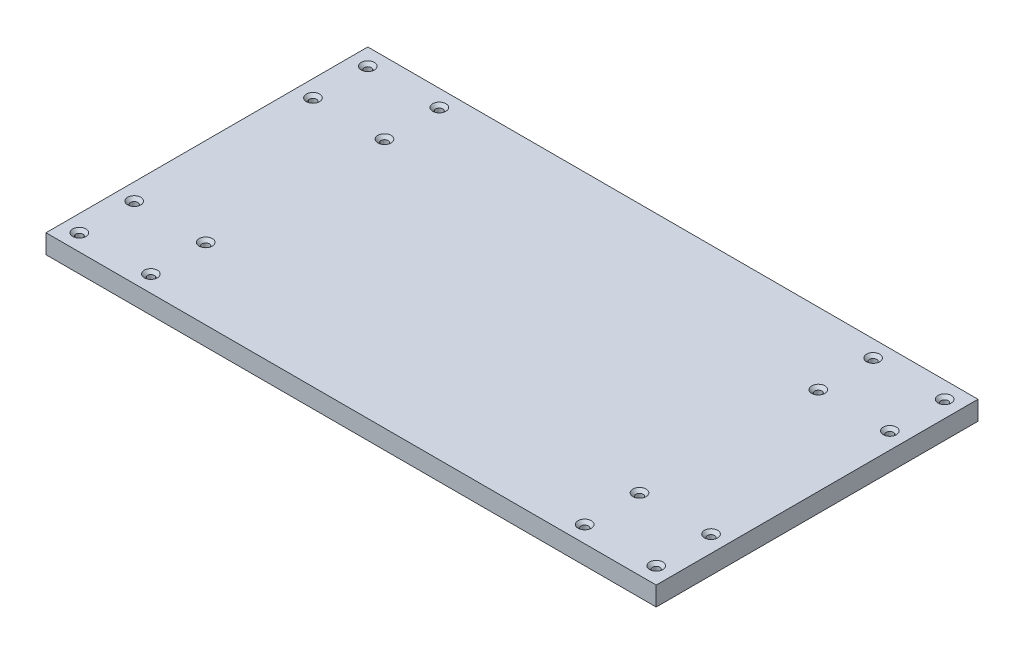
ISO-10303-21;
HEADER;
FILE_DESCRIPTION(('STEP AP214'),'2;1');
FILE_NAME('part.step','',(''),(''),'','','');
FILE_SCHEMA(('AUTOMOTIVE_DESIGN { 1 0 10303 214 1 1 1 1 }'));
ENDSEC;
DATA;
#1=APPLICATION_CONTEXT('core data for automotive mechanical design processes');
#2=APPLICATION_PROTOCOL_DEFINITION('international standard','automotive_design',2000,#1);
#3=PRODUCT_CONTEXT('',#1,'mechanical');
#4=PRODUCT('Part','Part','',(#3));
#5=PRODUCT_RELATED_PRODUCT_CATEGORY('part','',(#4));
#6=PRODUCT_DEFINITION_FORMATION('','',#4);
#7=PRODUCT_DEFINITION_CONTEXT('part definition',#1,'design');
#8=PRODUCT_DEFINITION('design','',#6,#7);
#9=PRODUCT_DEFINITION_SHAPE('','',#8);
#10=(LENGTH_UNIT() NAMED_UNIT(*) SI_UNIT(.MILLI.,.METRE.));
#11=(NAMED_UNIT(*) PLANE_ANGLE_UNIT() SI_UNIT($,.RADIAN.));
#12=(NAMED_UNIT(*) SI_UNIT($,.STERADIAN.) SOLID_ANGLE_UNIT());
#13=UNCERTAINTY_MEASURE_WITH_UNIT(LENGTH_MEASURE(1.E-05),#10,'distance_accuracy_value','');
#14=(GEOMETRIC_REPRESENTATION_CONTEXT(3) GLOBAL_UNCERTAINTY_ASSIGNED_CONTEXT((#13)) GLOBAL_UNIT_ASSIGNED_CONTEXT((#10,
#11,#12)) REPRESENTATION_CONTEXT('',''));
#15=CARTESIAN_POINT('',(0.,0.,0.));
#16=DIRECTION('',(0.,0.,1.));
#17=DIRECTION('',(1.,0.,0.));
#18=AXIS2_PLACEMENT_3D('',#15,#16,#17);
#19=CARTESIAN_POINT('',(0.,0.,0.));
#20=DIRECTION('',(0.,-1.,0.));
#21=DIRECTION('',(0.,0.,-1.));
#22=AXIS2_PLACEMENT_3D('',#19,#20,#21);
#23=PLANE('',#22);
#24=CARTESIAN_POINT('',(5.55625,0.,-101.6));
#25=DIRECTION('',(0.,1.,0.));
#26=DIRECTION('',(0.,0.,1.));
#27=AXIS2_PLACEMENT_3D('',#24,#25,#26);
#28=CIRCLE('',#27,1.2);
#29=CARTESIAN_POINT('',(5.55625,0.,-100.4));
#30=VERTEX_POINT('',#29);
#31=EDGE_CURVE('E314',#30,#30,#28,.T.);
#32=ORIENTED_EDGE('',*,*,#31,.T.);
#33=EDGE_LOOP('',(#32));
#34=FACE_BOUND('',#33,.T.);
#35=DIRECTION('',(0.,0.,1.));
#36=VECTOR('',#35,1.);
#37=CARTESIAN_POINT('',(0.,0.,0.));
#38=LINE('',#37,#36);
#39=CARTESIAN_POINT('',(0.,0.,-107.15625));
#40=VERTEX_POINT('',#39);
#41=CARTESIAN_POINT('',(0.,0.,0.));
#42=VERTEX_POINT('',#41);
#43=EDGE_CURVE('E114',#40,#42,#38,.T.);
#44=ORIENTED_EDGE('',*,*,#43,.F.);
#45=DIRECTION('',(-1.,0.,0.));
#46=VECTOR('',#45,1.);
#47=CARTESIAN_POINT('',(0.,0.,-107.15625));
#48=LINE('',#47,#46);
#49=CARTESIAN_POINT('',(203.2,0.,-107.15625));
#50=VERTEX_POINT('',#49);
#51=EDGE_CURVE('E86',#50,#40,#48,.T.);
#52=ORIENTED_EDGE('',*,*,#51,.F.);
#53=DIRECTION('',(0.,0.,-1.));
#54=VECTOR('',#53,1.);
#55=CARTESIAN_POINT('',(203.2,0.,0.));
#56=LINE('',#55,#54);
#57=CARTESIAN_POINT('',(203.2,0.,0.));
#58=VERTEX_POINT('',#57);
#59=EDGE_CURVE('E80',#58,#50,#56,.T.);
#60=ORIENTED_EDGE('',*,*,#59,.F.);
#61=DIRECTION('',(1.,0.,0.));
#62=VECTOR('',#61,1.);
#63=CARTESIAN_POINT('',(0.,0.,0.));
#64=LINE('',#63,#62);
#65=EDGE_CURVE('E103',#42,#58,#64,.T.);
#66=ORIENTED_EDGE('',*,*,#65,.F.);
#67=EDGE_LOOP('',(#44,#52,#60,#66));
#68=FACE_BOUND('',#67,.T.);
#69=CARTESIAN_POINT('',(29.36875,0.,-23.8125));
#70=DIRECTION('',(0.,1.,0.));
#71=DIRECTION('',(0.,0.,1.));
#72=AXIS2_PLACEMENT_3D('',#69,#70,#71);
#73=CIRCLE('',#72,1.2);
#74=CARTESIAN_POINT('',(29.36875,0.,-22.6125));
#75=VERTEX_POINT('',#74);
#76=EDGE_CURVE('E118',#75,#75,#73,.T.);
#77=ORIENTED_EDGE('',*,*,#76,.T.);
#78=EDGE_LOOP('',(#77));
#79=FACE_BOUND('',#78,.T.);
#80=CARTESIAN_POINT('',(197.64375,0.,-23.8125));
#81=DIRECTION('',(0.,1.,0.));
#82=DIRECTION('',(0.,0.,1.));
#83=AXIS2_PLACEMENT_3D('',#80,#81,#82);
#84=CIRCLE('',#83,1.20000000000001);
#85=CARTESIAN_POINT('',(197.64375,0.,-22.6125));
#86=VERTEX_POINT('',#85);
#87=EDGE_CURVE('E146',#86,#86,#84,.T.);
#88=ORIENTED_EDGE('',*,*,#87,.T.);
#89=EDGE_LOOP('',(#88));
#90=FACE_BOUND('',#89,.T.);
#91=CARTESIAN_POINT('',(173.83125,0.,-23.8125));
#92=DIRECTION('',(0.,1.,0.));
#93=DIRECTION('',(0.,0.,1.));
#94=AXIS2_PLACEMENT_3D('',#91,#92,#93);
#95=CIRCLE('',#94,1.20000000000001);
#96=CARTESIAN_POINT('',(173.83125,0.,-22.6125));
#97=VERTEX_POINT('',#96);
#98=EDGE_CURVE('E158',#97,#97,#95,.T.);
#99=ORIENTED_EDGE('',*,*,#98,.T.);
#100=EDGE_LOOP('',(#99));
#101=FACE_BOUND('',#100,.T.);
#102=CARTESIAN_POINT('',(197.64375,0.,-83.34375));
#103=DIRECTION('',(0.,1.,0.));
#104=DIRECTION('',(0.,0.,1.));
#105=AXIS2_PLACEMENT_3D('',#102,#103,#104);
#106=CIRCLE('',#105,1.20000000000001);
#107=CARTESIAN_POINT('',(197.64375,0.,-82.14375));
#108=VERTEX_POINT('',#107);
#109=EDGE_CURVE('E170',#108,#108,#106,.T.);
#110=ORIENTED_EDGE('',*,*,#109,.T.);
#111=EDGE_LOOP('',(#110));
#112=FACE_BOUND('',#111,.T.);
#113=CARTESIAN_POINT('',(173.83125,0.,-83.34375));
#114=DIRECTION('',(0.,1.,0.));
#115=DIRECTION('',(0.,0.,1.));
#116=AXIS2_PLACEMENT_3D('',#113,#114,#115);
#117=CIRCLE('',#116,1.20000000000001);
#118=CARTESIAN_POINT('',(173.83125,0.,-82.14375));
#119=VERTEX_POINT('',#118);
#120=EDGE_CURVE('E182',#119,#119,#117,.T.);
#121=ORIENTED_EDGE('',*,*,#120,.T.);
#122=EDGE_LOOP('',(#121));
#123=FACE_BOUND('',#122,.T.);
#124=CARTESIAN_POINT('',(5.55625,0.,-23.8125));
#125=DIRECTION('',(0.,1.,0.));
#126=DIRECTION('',(0.,0.,1.));
#127=AXIS2_PLACEMENT_3D('',#124,#125,#126);
#128=CIRCLE('',#127,1.2);
#129=CARTESIAN_POINT('',(5.55625,0.,-22.6125));
#130=VERTEX_POINT('',#129);
#131=EDGE_CURVE('E194',#130,#130,#128,.T.);
#132=ORIENTED_EDGE('',*,*,#131,.T.);
#133=EDGE_LOOP('',(#132));
#134=FACE_BOUND('',#133,.T.);
#135=CARTESIAN_POINT('',(29.36875,0.,-83.34375));
#136=DIRECTION('',(0.,1.,0.));
#137=DIRECTION('',(0.,0.,1.));
#138=AXIS2_PLACEMENT_3D('',#135,#136,#137);
#139=CIRCLE('',#138,1.2);
#140=CARTESIAN_POINT('',(29.36875,0.,-82.14375));
#141=VERTEX_POINT('',#140);
#142=EDGE_CURVE('E206',#141,#141,#139,.T.);
#143=ORIENTED_EDGE('',*,*,#142,.T.);
#144=EDGE_LOOP('',(#143));
#145=FACE_BOUND('',#144,.T.);
#146=CARTESIAN_POINT('',(5.55625000000001,0.,-83.34375));
#147=DIRECTION('',(0.,1.,0.));
#148=DIRECTION('',(0.,0.,1.));
#149=AXIS2_PLACEMENT_3D('',#146,#147,#148);
#150=CIRCLE('',#149,1.2);
#151=CARTESIAN_POINT('',(5.55625000000001,0.,-82.14375));
#152=VERTEX_POINT('',#151);
#153=EDGE_CURVE('E218',#152,#152,#150,.T.);
#154=ORIENTED_EDGE('',*,*,#153,.T.);
#155=EDGE_LOOP('',(#154));
#156=FACE_BOUND('',#155,.T.);
#157=CARTESIAN_POINT('',(197.64375,0.,-5.55625));
#158=DIRECTION('',(0.,1.,0.));
#159=DIRECTION('',(0.,0.,1.));
#160=AXIS2_PLACEMENT_3D('',#157,#158,#159);
#161=CIRCLE('',#160,1.20000000000001);
#162=CARTESIAN_POINT('',(197.64375,0.,-4.35624999999999));
#163=VERTEX_POINT('',#162);
#164=EDGE_CURVE('E230',#163,#163,#161,.T.);
#165=ORIENTED_EDGE('',*,*,#164,.T.);
#166=EDGE_LOOP('',(#165));
#167=FACE_BOUND('',#166,.T.);
#168=CARTESIAN_POINT('',(197.64375,0.,-101.6));
#169=DIRECTION('',(0.,1.,0.));
#170=DIRECTION('',(0.,0.,1.));
#171=AXIS2_PLACEMENT_3D('',#168,#169,#170);
#172=CIRCLE('',#171,1.20000000000001);
#173=CARTESIAN_POINT('',(197.64375,0.,-100.4));
#174=VERTEX_POINT('',#173);
#175=EDGE_CURVE('E242',#174,#174,#172,.T.);
#176=ORIENTED_EDGE('',*,*,#175,.T.);
#177=EDGE_LOOP('',(#176));
#178=FACE_BOUND('',#177,.T.);
#179=CARTESIAN_POINT('',(173.83125,0.,-101.6));
#180=DIRECTION('',(0.,1.,0.));
#181=DIRECTION('',(0.,0.,1.));
#182=AXIS2_PLACEMENT_3D('',#179,#180,#181);
#183=CIRCLE('',#182,1.20000000000001);
#184=CARTESIAN_POINT('',(173.83125,0.,-100.4));
#185=VERTEX_POINT('',#184);
#186=EDGE_CURVE('E254',#185,#185,#183,.T.);
#187=ORIENTED_EDGE('',*,*,#186,.T.);
#188=EDGE_LOOP('',(#187));
#189=FACE_BOUND('',#188,.T.);
#190=CARTESIAN_POINT('',(173.83125,0.,-5.55625));
#191=DIRECTION('',(0.,1.,0.));
#192=DIRECTION('',(0.,0.,1.));
#193=AXIS2_PLACEMENT_3D('',#190,#191,#192);
#194=CIRCLE('',#193,1.20000000000001);
#195=CARTESIAN_POINT('',(173.83125,0.,-4.35624999999999));
#196=VERTEX_POINT('',#195);
#197=EDGE_CURVE('E266',#196,#196,#194,.T.);
#198=ORIENTED_EDGE('',*,*,#197,.T.);
#199=EDGE_LOOP('',(#198));
#200=FACE_BOUND('',#199,.T.);
#201=CARTESIAN_POINT('',(29.36875,0.,-5.55625));
#202=DIRECTION('',(0.,1.,0.));
#203=DIRECTION('',(0.,0.,1.));
#204=AXIS2_PLACEMENT_3D('',#201,#202,#203);
#205=CIRCLE('',#204,1.2);
#206=CARTESIAN_POINT('',(29.36875,0.,-4.35625));
#207=VERTEX_POINT('',#206);
#208=EDGE_CURVE('E278',#207,#207,#205,.T.);
#209=ORIENTED_EDGE('',*,*,#208,.T.);
#210=EDGE_LOOP('',(#209));
#211=FACE_BOUND('',#210,.T.);
#212=CARTESIAN_POINT('',(5.55625,0.,-5.55625));
#213=DIRECTION('',(0.,1.,0.));
#214=DIRECTION('',(0.,0.,1.));
#215=AXIS2_PLACEMENT_3D('',#212,#213,#214);
#216=CIRCLE('',#215,1.2);
#217=CARTESIAN_POINT('',(5.55625,0.,-4.35625));
#218=VERTEX_POINT('',#217);
#219=EDGE_CURVE('E290',#218,#218,#216,.T.);
#220=ORIENTED_EDGE('',*,*,#219,.T.);
#221=EDGE_LOOP('',(#220));
#222=FACE_BOUND('',#221,.T.);
#223=CARTESIAN_POINT('',(29.36875,0.,-101.6));
#224=DIRECTION('',(0.,1.,0.));
#225=DIRECTION('',(0.,0.,1.));
#226=AXIS2_PLACEMENT_3D('',#223,#224,#225);
#227=CIRCLE('',#226,1.2);
#228=CARTESIAN_POINT('',(29.36875,0.,-100.4));
#229=VERTEX_POINT('',#228);
#230=EDGE_CURVE('E302',#229,#229,#227,.T.);
#231=ORIENTED_EDGE('',*,*,#230,.T.);
#232=EDGE_LOOP('',(#231));
#233=FACE_BOUND('',#232,.T.);
#234=ADVANCED_FACE('F45',(#34,#68,#79,#90,#101,#112,#123,#134,#145,#156,#167,#178,#189,#200,
#211,#222,#233),#23,.T.);
#235=CARTESIAN_POINT('',(0.,6.35,0.));
#236=DIRECTION('',(1.,0.,0.));
#237=DIRECTION('',(0.,0.,-1.));
#238=AXIS2_PLACEMENT_3D('',#235,#236,#237);
#239=PLANE('',#238);
#240=ORIENTED_EDGE('',*,*,#43,.T.);
#241=DIRECTION('',(0.,-1.,0.));
#242=VECTOR('',#241,1.);
#243=CARTESIAN_POINT('',(0.,6.35,0.));
#244=LINE('',#243,#242);
#245=CARTESIAN_POINT('',(0.,6.35,0.));
#246=VERTEX_POINT('',#245);
#247=EDGE_CURVE('E11',#246,#42,#244,.T.);
#248=ORIENTED_EDGE('',*,*,#247,.F.);
#249=DIRECTION('',(0.,0.,1.));
#250=VECTOR('',#249,1.);
#251=CARTESIAN_POINT('',(0.,6.35,0.));
#252=LINE('',#251,#250);
#253=CARTESIAN_POINT('',(0.,6.35,-107.15625));
#254=VERTEX_POINT('',#253);
#255=EDGE_CURVE('E98',#254,#246,#252,.T.);
#256=ORIENTED_EDGE('',*,*,#255,.F.);
#257=DIRECTION('',(0.,-1.,0.));
#258=VECTOR('',#257,1.);
#259=CARTESIAN_POINT('',(0.,6.35,-107.15625));
#260=LINE('',#259,#258);
#261=EDGE_CURVE('E110',#254,#40,#260,.T.);
#262=ORIENTED_EDGE('',*,*,#261,.T.);
#263=EDGE_LOOP('',(#240,#248,#256,#262));
#264=FACE_BOUND('',#263,.T.);
#265=ADVANCED_FACE('F47',(#264),#239,.F.);
#266=CARTESIAN_POINT('',(0.,6.35,0.));
#267=DIRECTION('',(0.,0.,-1.));
#268=DIRECTION('',(-1.,0.,0.));
#269=AXIS2_PLACEMENT_3D('',#266,#267,#268);
#270=PLANE('',#269);
#271=ORIENTED_EDGE('',*,*,#65,.T.);
#272=DIRECTION('',(0.,-1.,0.));
#273=VECTOR('',#272,1.);
#274=CARTESIAN_POINT('',(203.2,6.35,0.));
#275=LINE('',#274,#273);
#276=CARTESIAN_POINT('',(203.2,6.35,0.));
#277=VERTEX_POINT('',#276);
#278=EDGE_CURVE('E55',#277,#58,#275,.T.);
#279=ORIENTED_EDGE('',*,*,#278,.F.);
#280=DIRECTION('',(1.,0.,0.));
#281=VECTOR('',#280,1.);
#282=CARTESIAN_POINT('',(0.,6.35,0.));
#283=LINE('',#282,#281);
#284=EDGE_CURVE('E93',#246,#277,#283,.T.);
#285=ORIENTED_EDGE('',*,*,#284,.F.);
#286=ORIENTED_EDGE('',*,*,#247,.T.);
#287=EDGE_LOOP('',(#271,#279,#285,#286));
#288=FACE_BOUND('',#287,.T.);
#289=ADVANCED_FACE('F102',(#288),#270,.F.);
#290=CARTESIAN_POINT('',(203.2,6.35,0.));
#291=DIRECTION('',(-1.,0.,0.));
#292=DIRECTION('',(0.,0.,1.));
#293=AXIS2_PLACEMENT_3D('',#290,#291,#292);
#294=PLANE('',#293);
#295=ORIENTED_EDGE('',*,*,#59,.T.);
#296=DIRECTION('',(0.,-1.,0.));
#297=VECTOR('',#296,1.);
#298=CARTESIAN_POINT('',(203.2,6.35,-107.15625));
#299=LINE('',#298,#297);
#300=CARTESIAN_POINT('',(203.2,6.35,-107.15625));
#301=VERTEX_POINT('',#300);
#302=EDGE_CURVE('E105',#301,#50,#299,.T.);
#303=ORIENTED_EDGE('',*,*,#302,.F.);
#304=DIRECTION('',(0.,0.,-1.));
#305=VECTOR('',#304,1.);
#306=CARTESIAN_POINT('',(203.2,6.35,0.));
#307=LINE('',#306,#305);
#308=EDGE_CURVE('E96',#277,#301,#307,.T.);
#309=ORIENTED_EDGE('',*,*,#308,.F.);
#310=ORIENTED_EDGE('',*,*,#278,.T.);
#311=EDGE_LOOP('',(#295,#303,#309,#310));
#312=FACE_BOUND('',#311,.T.);
#313=ADVANCED_FACE('F106',(#312),#294,.F.);
#314=CARTESIAN_POINT('',(0.,6.35,-107.15625));
#315=DIRECTION('',(0.,0.,1.));
#316=DIRECTION('',(1.,0.,0.));
#317=AXIS2_PLACEMENT_3D('',#314,#315,#316);
#318=PLANE('',#317);
#319=ORIENTED_EDGE('',*,*,#51,.T.);
#320=ORIENTED_EDGE('',*,*,#261,.F.);
#321=DIRECTION('',(-1.,0.,0.));
#322=VECTOR('',#321,1.);
#323=CARTESIAN_POINT('',(0.,6.35,-107.15625));
#324=LINE('',#323,#322);
#325=EDGE_CURVE('E63',#301,#254,#324,.T.);
#326=ORIENTED_EDGE('',*,*,#325,.F.);
#327=ORIENTED_EDGE('',*,*,#302,.T.);
#328=EDGE_LOOP('',(#319,#320,#326,#327));
#329=FACE_BOUND('',#328,.T.);
#330=ADVANCED_FACE('F128',(#329),#318,.F.);
#331=CARTESIAN_POINT('',(0.,6.35,0.));
#332=DIRECTION('',(0.,-1.,0.));
#333=DIRECTION('',(0.,0.,-1.));
#334=AXIS2_PLACEMENT_3D('',#331,#332,#333);
#335=PLANE('',#334);
#336=CARTESIAN_POINT('',(5.55625,6.35,-101.6));
#337=DIRECTION('',(0.,1.,0.));
#338=DIRECTION('',(0.,0.,1.));
#339=AXIS2_PLACEMENT_3D('',#336,#337,#338);
#340=CIRCLE('',#339,2.2);
#341=CARTESIAN_POINT('',(5.55625,6.35,-99.4));
#342=VERTEX_POINT('',#341);
#343=EDGE_CURVE('E322',#342,#342,#340,.T.);
#344=ORIENTED_EDGE('',*,*,#343,.F.);
#345=EDGE_LOOP('',(#344));
#346=FACE_BOUND('',#345,.T.);
#347=CARTESIAN_POINT('',(29.36875,6.35,-101.6));
#348=DIRECTION('',(0.,1.,0.));
#349=DIRECTION('',(0.,0.,1.));
#350=AXIS2_PLACEMENT_3D('',#347,#348,#349);
#351=CIRCLE('',#350,2.2);
#352=CARTESIAN_POINT('',(29.36875,6.35,-99.4));
#353=VERTEX_POINT('',#352);
#354=EDGE_CURVE('E310',#353,#353,#351,.T.);
#355=ORIENTED_EDGE('',*,*,#354,.F.);
#356=EDGE_LOOP('',(#355));
#357=FACE_BOUND('',#356,.T.);
#358=CARTESIAN_POINT('',(5.55625,6.35,-5.55625));
#359=DIRECTION('',(0.,1.,0.));
#360=DIRECTION('',(0.,0.,1.));
#361=AXIS2_PLACEMENT_3D('',#358,#359,#360);
#362=CIRCLE('',#361,2.2);
#363=CARTESIAN_POINT('',(5.55625,6.35,-3.35625));
#364=VERTEX_POINT('',#363);
#365=EDGE_CURVE('E298',#364,#364,#362,.T.);
#366=ORIENTED_EDGE('',*,*,#365,.F.);
#367=EDGE_LOOP('',(#366));
#368=FACE_BOUND('',#367,.T.);
#369=CARTESIAN_POINT('',(29.36875,6.35,-5.55625));
#370=DIRECTION('',(0.,1.,0.));
#371=DIRECTION('',(0.,0.,1.));
#372=AXIS2_PLACEMENT_3D('',#369,#370,#371);
#373=CIRCLE('',#372,2.2);
#374=CARTESIAN_POINT('',(29.36875,6.35,-3.35625));
#375=VERTEX_POINT('',#374);
#376=EDGE_CURVE('E286',#375,#375,#373,.T.);
#377=ORIENTED_EDGE('',*,*,#376,.F.);
#378=EDGE_LOOP('',(#377));
#379=FACE_BOUND('',#378,.T.);
#380=CARTESIAN_POINT('',(173.83125,6.35,-5.55625));
#381=DIRECTION('',(0.,1.,0.));
#382=DIRECTION('',(0.,0.,1.));
#383=AXIS2_PLACEMENT_3D('',#380,#381,#382);
#384=CIRCLE('',#383,2.20000000000001);
#385=CARTESIAN_POINT('',(173.83125,6.35,-3.35624999999999));
#386=VERTEX_POINT('',#385);
#387=EDGE_CURVE('E274',#386,#386,#384,.T.);
#388=ORIENTED_EDGE('',*,*,#387,.F.);
#389=EDGE_LOOP('',(#388));
#390=FACE_BOUND('',#389,.T.);
#391=CARTESIAN_POINT('',(173.83125,6.35,-101.6));
#392=DIRECTION('',(0.,1.,0.));
#393=DIRECTION('',(0.,0.,1.));
#394=AXIS2_PLACEMENT_3D('',#391,#392,#393);
#395=CIRCLE('',#394,2.20000000000001);
#396=CARTESIAN_POINT('',(173.83125,6.35,-99.4));
#397=VERTEX_POINT('',#396);
#398=EDGE_CURVE('E262',#397,#397,#395,.T.);
#399=ORIENTED_EDGE('',*,*,#398,.F.);
#400=EDGE_LOOP('',(#399));
#401=FACE_BOUND('',#400,.T.);
#402=CARTESIAN_POINT('',(197.64375,6.35,-101.6));
#403=DIRECTION('',(0.,1.,0.));
#404=DIRECTION('',(0.,0.,1.));
#405=AXIS2_PLACEMENT_3D('',#402,#403,#404);
#406=CIRCLE('',#405,2.20000000000001);
#407=CARTESIAN_POINT('',(197.64375,6.35,-99.4));
#408=VERTEX_POINT('',#407);
#409=EDGE_CURVE('E250',#408,#408,#406,.T.);
#410=ORIENTED_EDGE('',*,*,#409,.F.);
#411=EDGE_LOOP('',(#410));
#412=FACE_BOUND('',#411,.T.);
#413=CARTESIAN_POINT('',(197.64375,6.35,-5.55625));
#414=DIRECTION('',(0.,1.,0.));
#415=DIRECTION('',(0.,0.,1.));
#416=AXIS2_PLACEMENT_3D('',#413,#414,#415);
#417=CIRCLE('',#416,2.20000000000001);
#418=CARTESIAN_POINT('',(197.64375,6.35,-3.35624999999999));
#419=VERTEX_POINT('',#418);
#420=EDGE_CURVE('E238',#419,#419,#417,.T.);
#421=ORIENTED_EDGE('',*,*,#420,.F.);
#422=EDGE_LOOP('',(#421));
#423=FACE_BOUND('',#422,.T.);
#424=CARTESIAN_POINT('',(5.55625000000001,6.35,-83.34375));
#425=DIRECTION('',(0.,1.,0.));
#426=DIRECTION('',(0.,0.,1.));
#427=AXIS2_PLACEMENT_3D('',#424,#425,#426);
#428=CIRCLE('',#427,2.2);
#429=CARTESIAN_POINT('',(5.55625000000001,6.35,-81.14375));
#430=VERTEX_POINT('',#429);
#431=EDGE_CURVE('E226',#430,#430,#428,.T.);
#432=ORIENTED_EDGE('',*,*,#431,.F.);
#433=EDGE_LOOP('',(#432));
#434=FACE_BOUND('',#433,.T.);
#435=CARTESIAN_POINT('',(29.36875,6.35,-83.34375));
#436=DIRECTION('',(0.,1.,0.));
#437=DIRECTION('',(0.,0.,1.));
#438=AXIS2_PLACEMENT_3D('',#435,#436,#437);
#439=CIRCLE('',#438,2.2);
#440=CARTESIAN_POINT('',(29.36875,6.35,-81.14375));
#441=VERTEX_POINT('',#440);
#442=EDGE_CURVE('E214',#441,#441,#439,.T.);
#443=ORIENTED_EDGE('',*,*,#442,.F.);
#444=EDGE_LOOP('',(#443));
#445=FACE_BOUND('',#444,.T.);
#446=CARTESIAN_POINT('',(5.55625,6.35,-23.8125));
#447=DIRECTION('',(0.,1.,0.));
#448=DIRECTION('',(0.,0.,1.));
#449=AXIS2_PLACEMENT_3D('',#446,#447,#448);
#450=CIRCLE('',#449,2.2);
#451=CARTESIAN_POINT('',(5.55625,6.35,-21.6125));
#452=VERTEX_POINT('',#451);
#453=EDGE_CURVE('E202',#452,#452,#450,.T.);
#454=ORIENTED_EDGE('',*,*,#453,.F.);
#455=EDGE_LOOP('',(#454));
#456=FACE_BOUND('',#455,.T.);
#457=CARTESIAN_POINT('',(173.83125,6.35,-83.34375));
#458=DIRECTION('',(0.,1.,0.));
#459=DIRECTION('',(0.,0.,1.));
#460=AXIS2_PLACEMENT_3D('',#457,#458,#459);
#461=CIRCLE('',#460,2.20000000000001);
#462=CARTESIAN_POINT('',(173.83125,6.35,-81.14375));
#463=VERTEX_POINT('',#462);
#464=EDGE_CURVE('E190',#463,#463,#461,.T.);
#465=ORIENTED_EDGE('',*,*,#464,.F.);
#466=EDGE_LOOP('',(#465));
#467=FACE_BOUND('',#466,.T.);
#468=CARTESIAN_POINT('',(197.64375,6.35,-83.34375));
#469=DIRECTION('',(0.,1.,0.));
#470=DIRECTION('',(0.,0.,1.));
#471=AXIS2_PLACEMENT_3D('',#468,#469,#470);
#472=CIRCLE('',#471,2.20000000000001);
#473=CARTESIAN_POINT('',(197.64375,6.35,-81.14375));
#474=VERTEX_POINT('',#473);
#475=EDGE_CURVE('E178',#474,#474,#472,.T.);
#476=ORIENTED_EDGE('',*,*,#475,.F.);
#477=EDGE_LOOP('',(#476));
#478=FACE_BOUND('',#477,.T.);
#479=CARTESIAN_POINT('',(173.83125,6.35,-23.8125));
#480=DIRECTION('',(0.,1.,0.));
#481=DIRECTION('',(0.,0.,1.));
#482=AXIS2_PLACEMENT_3D('',#479,#480,#481);
#483=CIRCLE('',#482,2.20000000000001);
#484=CARTESIAN_POINT('',(173.83125,6.35,-21.6125));
#485=VERTEX_POINT('',#484);
#486=EDGE_CURVE('E166',#485,#485,#483,.T.);
#487=ORIENTED_EDGE('',*,*,#486,.F.);
#488=EDGE_LOOP('',(#487));
#489=FACE_BOUND('',#488,.T.);
#490=CARTESIAN_POINT('',(197.64375,6.35,-23.8125));
#491=DIRECTION('',(0.,1.,0.));
#492=DIRECTION('',(0.,0.,1.));
#493=AXIS2_PLACEMENT_3D('',#490,#491,#492);
#494=CIRCLE('',#493,2.20000000000001);
#495=CARTESIAN_POINT('',(197.64375,6.35,-21.6125));
#496=VERTEX_POINT('',#495);
#497=EDGE_CURVE('E154',#496,#496,#494,.T.);
#498=ORIENTED_EDGE('',*,*,#497,.F.);
#499=EDGE_LOOP('',(#498));
#500=FACE_BOUND('',#499,.T.);
#501=CARTESIAN_POINT('',(29.36875,6.35,-23.8125));
#502=DIRECTION('',(0.,1.,0.));
#503=DIRECTION('',(0.,0.,1.));
#504=AXIS2_PLACEMENT_3D('',#501,#502,#503);
#505=CIRCLE('',#504,2.2);
#506=CARTESIAN_POINT('',(29.36875,6.35,-21.6125));
#507=VERTEX_POINT('',#506);
#508=EDGE_CURVE('E142',#507,#507,#505,.T.);
#509=ORIENTED_EDGE('',*,*,#508,.F.);
#510=EDGE_LOOP('',(#509));
#511=FACE_BOUND('',#510,.T.);
#512=ORIENTED_EDGE('',*,*,#255,.T.);
#513=ORIENTED_EDGE('',*,*,#284,.T.);
#514=ORIENTED_EDGE('',*,*,#308,.T.);
#515=ORIENTED_EDGE('',*,*,#325,.T.);
#516=EDGE_LOOP('',(#512,#513,#514,#515));
#517=FACE_BOUND('',#516,.T.);
#518=ADVANCED_FACE('F94',(#346,#357,#368,#379,#390,#401,#412,#423,#434,#445,#456,#467,#478,#489,
#500,#511,#517),#335,.F.);
#519=CARTESIAN_POINT('',(29.36875,6.35,-23.8125));
#520=DIRECTION('',(0.,1.,0.));
#521=DIRECTION('',(0.,0.,1.));
#522=AXIS2_PLACEMENT_3D('',#519,#520,#521);
#523=CYLINDRICAL_SURFACE('',#522,1.2);
#524=ORIENTED_EDGE('',*,*,#76,.F.);
#525=EDGE_LOOP('',(#524));
#526=FACE_BOUND('',#525,.T.);
#527=CARTESIAN_POINT('',(29.36875,5.35,-23.8125));
#528=DIRECTION('',(0.,1.,0.));
#529=DIRECTION('',(0.,0.,1.));
#530=AXIS2_PLACEMENT_3D('',#527,#528,#529);
#531=CIRCLE('',#530,1.2);
#532=CARTESIAN_POINT('',(29.36875,5.35,-22.6125));
#533=VERTEX_POINT('',#532);
#534=EDGE_CURVE('E138',#533,#533,#531,.T.);
#535=ORIENTED_EDGE('',*,*,#534,.T.);
#536=EDGE_LOOP('',(#535));
#537=FACE_BOUND('',#536,.T.);
#538=ADVANCED_FACE('F331',(#526,#537),#523,.F.);
#539=CARTESIAN_POINT('',(29.36875,6.35,-23.8125));
#540=DIRECTION('',(0.,1.,0.));
#541=DIRECTION('',(0.,0.,1.));
#542=AXIS2_PLACEMENT_3D('',#539,#540,#541);
#543=CONICAL_SURFACE('',#542,2.2,0.785398163397448);
#544=ORIENTED_EDGE('',*,*,#534,.F.);
#545=EDGE_LOOP('',(#544));
#546=FACE_BOUND('',#545,.T.);
#547=ORIENTED_EDGE('',*,*,#508,.T.);
#548=EDGE_LOOP('',(#547));
#549=FACE_BOUND('',#548,.T.);
#550=ADVANCED_FACE('F363',(#546,#549),#543,.F.);
#551=CARTESIAN_POINT('',(197.64375,6.35,-23.8125));
#552=DIRECTION('',(0.,1.,0.));
#553=DIRECTION('',(0.,0.,1.));
#554=AXIS2_PLACEMENT_3D('',#551,#552,#553);
#555=CYLINDRICAL_SURFACE('',#554,1.20000000000001);
#556=ORIENTED_EDGE('',*,*,#87,.F.);
#557=EDGE_LOOP('',(#556));
#558=FACE_BOUND('',#557,.T.);
#559=CARTESIAN_POINT('',(197.64375,5.35,-23.8125));
#560=DIRECTION('',(0.,1.,0.));
#561=DIRECTION('',(0.,0.,1.));
#562=AXIS2_PLACEMENT_3D('',#559,#560,#561);
#563=CIRCLE('',#562,1.20000000000001);
#564=CARTESIAN_POINT('',(197.64375,5.35,-22.6125));
#565=VERTEX_POINT('',#564);
#566=EDGE_CURVE('E150',#565,#565,#563,.T.);
#567=ORIENTED_EDGE('',*,*,#566,.T.);
#568=EDGE_LOOP('',(#567));
#569=FACE_BOUND('',#568,.T.);
#570=ADVANCED_FACE('F365',(#558,#569),#555,.F.);
#571=CARTESIAN_POINT('',(197.64375,6.35,-23.8125));
#572=DIRECTION('',(0.,1.,0.));
#573=DIRECTION('',(0.,0.,1.));
#574=AXIS2_PLACEMENT_3D('',#571,#572,#573);
#575=CONICAL_SURFACE('',#574,2.20000000000001,0.785398163397448);
#576=ORIENTED_EDGE('',*,*,#566,.F.);
#577=EDGE_LOOP('',(#576));
#578=FACE_BOUND('',#577,.T.);
#579=ORIENTED_EDGE('',*,*,#497,.T.);
#580=EDGE_LOOP('',(#579));
#581=FACE_BOUND('',#580,.T.);
#582=ADVANCED_FACE('F372',(#578,#581),#575,.F.);
#583=CARTESIAN_POINT('',(173.83125,6.35,-23.8125));
#584=DIRECTION('',(0.,1.,0.));
#585=DIRECTION('',(0.,0.,1.));
#586=AXIS2_PLACEMENT_3D('',#583,#584,#585);
#587=CYLINDRICAL_SURFACE('',#586,1.20000000000001);
#588=ORIENTED_EDGE('',*,*,#98,.F.);
#589=EDGE_LOOP('',(#588));
#590=FACE_BOUND('',#589,.T.);
#591=CARTESIAN_POINT('',(173.83125,5.35,-23.8125));
#592=DIRECTION('',(0.,1.,0.));
#593=DIRECTION('',(0.,0.,1.));
#594=AXIS2_PLACEMENT_3D('',#591,#592,#593);
#595=CIRCLE('',#594,1.20000000000001);
#596=CARTESIAN_POINT('',(173.83125,5.35,-22.6125));
#597=VERTEX_POINT('',#596);
#598=EDGE_CURVE('E162',#597,#597,#595,.T.);
#599=ORIENTED_EDGE('',*,*,#598,.T.);
#600=EDGE_LOOP('',(#599));
#601=FACE_BOUND('',#600,.T.);
#602=ADVANCED_FACE('F439',(#590,#601),#587,.F.);
#603=CARTESIAN_POINT('',(173.83125,6.35,-23.8125));
#604=DIRECTION('',(0.,1.,0.));
#605=DIRECTION('',(0.,0.,1.));
#606=AXIS2_PLACEMENT_3D('',#603,#604,#605);
#607=CONICAL_SURFACE('',#606,2.20000000000001,0.785398163397448);
#608=ORIENTED_EDGE('',*,*,#598,.F.);
#609=EDGE_LOOP('',(#608));
#610=FACE_BOUND('',#609,.T.);
#611=ORIENTED_EDGE('',*,*,#486,.T.);
#612=EDGE_LOOP('',(#611));
#613=FACE_BOUND('',#612,.T.);
#614=ADVANCED_FACE('F449',(#610,#613),#607,.F.);
#615=CARTESIAN_POINT('',(197.64375,6.35,-83.34375));
#616=DIRECTION('',(0.,1.,0.));
#617=DIRECTION('',(0.,0.,1.));
#618=AXIS2_PLACEMENT_3D('',#615,#616,#617);
#619=CYLINDRICAL_SURFACE('',#618,1.20000000000001);
#620=ORIENTED_EDGE('',*,*,#109,.F.);
#621=EDGE_LOOP('',(#620));
#622=FACE_BOUND('',#621,.T.);
#623=CARTESIAN_POINT('',(197.64375,5.35,-83.34375));
#624=DIRECTION('',(0.,1.,0.));
#625=DIRECTION('',(0.,0.,1.));
#626=AXIS2_PLACEMENT_3D('',#623,#624,#625);
#627=CIRCLE('',#626,1.20000000000001);
#628=CARTESIAN_POINT('',(197.64375,5.35,-82.14375));
#629=VERTEX_POINT('',#628);
#630=EDGE_CURVE('E174',#629,#629,#627,.T.);
#631=ORIENTED_EDGE('',*,*,#630,.T.);
#632=EDGE_LOOP('',(#631));
#633=FACE_BOUND('',#632,.T.);
#634=ADVANCED_FACE('F459',(#622,#633),#619,.F.);
#635=CARTESIAN_POINT('',(197.64375,6.35,-83.34375));
#636=DIRECTION('',(0.,1.,0.));
#637=DIRECTION('',(0.,0.,1.));
#638=AXIS2_PLACEMENT_3D('',#635,#636,#637);
#639=CONICAL_SURFACE('',#638,2.20000000000001,0.785398163397448);
#640=ORIENTED_EDGE('',*,*,#630,.F.);
#641=EDGE_LOOP('',(#640));
#642=FACE_BOUND('',#641,.T.);
#643=ORIENTED_EDGE('',*,*,#475,.T.);
#644=EDGE_LOOP('',(#643));
#645=FACE_BOUND('',#644,.T.);
#646=ADVANCED_FACE('F469',(#642,#645),#639,.F.);
#647=CARTESIAN_POINT('',(173.83125,6.35,-83.34375));
#648=DIRECTION('',(0.,1.,0.));
#649=DIRECTION('',(0.,0.,1.));
#650=AXIS2_PLACEMENT_3D('',#647,#648,#649);
#651=CYLINDRICAL_SURFACE('',#650,1.20000000000001);
#652=ORIENTED_EDGE('',*,*,#120,.F.);
#653=EDGE_LOOP('',(#652));
#654=FACE_BOUND('',#653,.T.);
#655=CARTESIAN_POINT('',(173.83125,5.35,-83.34375));
#656=DIRECTION('',(0.,1.,0.));
#657=DIRECTION('',(0.,0.,1.));
#658=AXIS2_PLACEMENT_3D('',#655,#656,#657);
#659=CIRCLE('',#658,1.20000000000001);
#660=CARTESIAN_POINT('',(173.83125,5.35,-82.14375));
#661=VERTEX_POINT('',#660);
#662=EDGE_CURVE('E186',#661,#661,#659,.T.);
#663=ORIENTED_EDGE('',*,*,#662,.T.);
#664=EDGE_LOOP('',(#663));
#665=FACE_BOUND('',#664,.T.);
#666=ADVANCED_FACE('F479',(#654,#665),#651,.F.);
#667=CARTESIAN_POINT('',(173.83125,6.35,-83.34375));
#668=DIRECTION('',(0.,1.,0.));
#669=DIRECTION('',(0.,0.,1.));
#670=AXIS2_PLACEMENT_3D('',#667,#668,#669);
#671=CONICAL_SURFACE('',#670,2.20000000000001,0.785398163397448);
#672=ORIENTED_EDGE('',*,*,#662,.F.);
#673=EDGE_LOOP('',(#672));
#674=FACE_BOUND('',#673,.T.);
#675=ORIENTED_EDGE('',*,*,#464,.T.);
#676=EDGE_LOOP('',(#675));
#677=FACE_BOUND('',#676,.T.);
#678=ADVANCED_FACE('F489',(#674,#677),#671,.F.);
#679=CARTESIAN_POINT('',(5.55625,6.35,-23.8125));
#680=DIRECTION('',(0.,1.,0.));
#681=DIRECTION('',(0.,0.,1.));
#682=AXIS2_PLACEMENT_3D('',#679,#680,#681);
#683=CYLINDRICAL_SURFACE('',#682,1.2);
#684=ORIENTED_EDGE('',*,*,#131,.F.);
#685=EDGE_LOOP('',(#684));
#686=FACE_BOUND('',#685,.T.);
#687=CARTESIAN_POINT('',(5.55625,5.35,-23.8125));
#688=DIRECTION('',(0.,1.,0.));
#689=DIRECTION('',(0.,0.,1.));
#690=AXIS2_PLACEMENT_3D('',#687,#688,#689);
#691=CIRCLE('',#690,1.2);
#692=CARTESIAN_POINT('',(5.55625,5.35,-22.6125));
#693=VERTEX_POINT('',#692);
#694=EDGE_CURVE('E198',#693,#693,#691,.T.);
#695=ORIENTED_EDGE('',*,*,#694,.T.);
#696=EDGE_LOOP('',(#695));
#697=FACE_BOUND('',#696,.T.);
#698=ADVANCED_FACE('F499',(#686,#697),#683,.F.);
#699=CARTESIAN_POINT('',(5.55625,6.35,-23.8125));
#700=DIRECTION('',(0.,1.,0.));
#701=DIRECTION('',(0.,0.,1.));
#702=AXIS2_PLACEMENT_3D('',#699,#700,#701);
#703=CONICAL_SURFACE('',#702,2.2,0.785398163397449);
#704=ORIENTED_EDGE('',*,*,#694,.F.);
#705=EDGE_LOOP('',(#704));
#706=FACE_BOUND('',#705,.T.);
#707=ORIENTED_EDGE('',*,*,#453,.T.);
#708=EDGE_LOOP('',(#707));
#709=FACE_BOUND('',#708,.T.);
#710=ADVANCED_FACE('F509',(#706,#709),#703,.F.);
#711=CARTESIAN_POINT('',(29.36875,6.35,-83.34375));
#712=DIRECTION('',(0.,1.,0.));
#713=DIRECTION('',(0.,0.,1.));
#714=AXIS2_PLACEMENT_3D('',#711,#712,#713);
#715=CYLINDRICAL_SURFACE('',#714,1.2);
#716=ORIENTED_EDGE('',*,*,#142,.F.);
#717=EDGE_LOOP('',(#716));
#718=FACE_BOUND('',#717,.T.);
#719=CARTESIAN_POINT('',(29.36875,5.35,-83.34375));
#720=DIRECTION('',(0.,1.,0.));
#721=DIRECTION('',(0.,0.,1.));
#722=AXIS2_PLACEMENT_3D('',#719,#720,#721);
#723=CIRCLE('',#722,1.2);
#724=CARTESIAN_POINT('',(29.36875,5.35,-82.14375));
#725=VERTEX_POINT('',#724);
#726=EDGE_CURVE('E210',#725,#725,#723,.T.);
#727=ORIENTED_EDGE('',*,*,#726,.T.);
#728=EDGE_LOOP('',(#727));
#729=FACE_BOUND('',#728,.T.);
#730=ADVANCED_FACE('F519',(#718,#729),#715,.F.);
#731=CARTESIAN_POINT('',(29.36875,6.35,-83.34375));
#732=DIRECTION('',(0.,1.,0.));
#733=DIRECTION('',(0.,0.,1.));
#734=AXIS2_PLACEMENT_3D('',#731,#732,#733);
#735=CONICAL_SURFACE('',#734,2.2,0.785398163397447);
#736=ORIENTED_EDGE('',*,*,#726,.F.);
#737=EDGE_LOOP('',(#736));
#738=FACE_BOUND('',#737,.T.);
#739=ORIENTED_EDGE('',*,*,#442,.T.);
#740=EDGE_LOOP('',(#739));
#741=FACE_BOUND('',#740,.T.);
#742=ADVANCED_FACE('F529',(#738,#741),#735,.F.);
#743=CARTESIAN_POINT('',(5.55625000000001,6.35,-83.34375));
#744=DIRECTION('',(0.,1.,0.));
#745=DIRECTION('',(0.,0.,1.));
#746=AXIS2_PLACEMENT_3D('',#743,#744,#745);
#747=CYLINDRICAL_SURFACE('',#746,1.2);
#748=ORIENTED_EDGE('',*,*,#153,.F.);
#749=EDGE_LOOP('',(#748));
#750=FACE_BOUND('',#749,.T.);
#751=CARTESIAN_POINT('',(5.55625000000001,5.35,-83.34375));
#752=DIRECTION('',(0.,1.,0.));
#753=DIRECTION('',(0.,0.,1.));
#754=AXIS2_PLACEMENT_3D('',#751,#752,#753);
#755=CIRCLE('',#754,1.2);
#756=CARTESIAN_POINT('',(5.55625000000001,5.35,-82.14375));
#757=VERTEX_POINT('',#756);
#758=EDGE_CURVE('E222',#757,#757,#755,.T.);
#759=ORIENTED_EDGE('',*,*,#758,.T.);
#760=EDGE_LOOP('',(#759));
#761=FACE_BOUND('',#760,.T.);
#762=ADVANCED_FACE('F539',(#750,#761),#747,.F.);
#763=CARTESIAN_POINT('',(5.55625000000001,6.35,-83.34375));
#764=DIRECTION('',(0.,1.,0.));
#765=DIRECTION('',(0.,0.,1.));
#766=AXIS2_PLACEMENT_3D('',#763,#764,#765);
#767=CONICAL_SURFACE('',#766,2.2,0.785398163397448);
#768=ORIENTED_EDGE('',*,*,#758,.F.);
#769=EDGE_LOOP('',(#768));
#770=FACE_BOUND('',#769,.T.);
#771=ORIENTED_EDGE('',*,*,#431,.T.);
#772=EDGE_LOOP('',(#771));
#773=FACE_BOUND('',#772,.T.);
#774=ADVANCED_FACE('F549',(#770,#773),#767,.F.);
#775=CARTESIAN_POINT('',(197.64375,6.35,-5.55625));
#776=DIRECTION('',(0.,1.,0.));
#777=DIRECTION('',(0.,0.,1.));
#778=AXIS2_PLACEMENT_3D('',#775,#776,#777);
#779=CYLINDRICAL_SURFACE('',#778,1.20000000000001);
#780=ORIENTED_EDGE('',*,*,#164,.F.);
#781=EDGE_LOOP('',(#780));
#782=FACE_BOUND('',#781,.T.);
#783=CARTESIAN_POINT('',(197.64375,5.35,-5.55625));
#784=DIRECTION('',(0.,1.,0.));
#785=DIRECTION('',(0.,0.,1.));
#786=AXIS2_PLACEMENT_3D('',#783,#784,#785);
#787=CIRCLE('',#786,1.20000000000001);
#788=CARTESIAN_POINT('',(197.64375,5.35,-4.35624999999999));
#789=VERTEX_POINT('',#788);
#790=EDGE_CURVE('E234',#789,#789,#787,.T.);
#791=ORIENTED_EDGE('',*,*,#790,.T.);
#792=EDGE_LOOP('',(#791));
#793=FACE_BOUND('',#792,.T.);
#794=ADVANCED_FACE('F559',(#782,#793),#779,.F.);
#795=CARTESIAN_POINT('',(197.64375,6.35,-5.55625));
#796=DIRECTION('',(0.,1.,0.));
#797=DIRECTION('',(0.,0.,1.));
#798=AXIS2_PLACEMENT_3D('',#795,#796,#797);
#799=CONICAL_SURFACE('',#798,2.20000000000001,0.785398163397448);
#800=ORIENTED_EDGE('',*,*,#790,.F.);
#801=EDGE_LOOP('',(#800));
#802=FACE_BOUND('',#801,.T.);
#803=ORIENTED_EDGE('',*,*,#420,.T.);
#804=EDGE_LOOP('',(#803));
#805=FACE_BOUND('',#804,.T.);
#806=ADVANCED_FACE('F569',(#802,#805),#799,.F.);
#807=CARTESIAN_POINT('',(197.64375,6.35,-101.6));
#808=DIRECTION('',(0.,1.,0.));
#809=DIRECTION('',(0.,0.,1.));
#810=AXIS2_PLACEMENT_3D('',#807,#808,#809);
#811=CYLINDRICAL_SURFACE('',#810,1.20000000000001);
#812=ORIENTED_EDGE('',*,*,#175,.F.);
#813=EDGE_LOOP('',(#812));
#814=FACE_BOUND('',#813,.T.);
#815=CARTESIAN_POINT('',(197.64375,5.35,-101.6));
#816=DIRECTION('',(0.,1.,0.));
#817=DIRECTION('',(0.,0.,1.));
#818=AXIS2_PLACEMENT_3D('',#815,#816,#817);
#819=CIRCLE('',#818,1.20000000000001);
#820=CARTESIAN_POINT('',(197.64375,5.35,-100.4));
#821=VERTEX_POINT('',#820);
#822=EDGE_CURVE('E246',#821,#821,#819,.T.);
#823=ORIENTED_EDGE('',*,*,#822,.T.);
#824=EDGE_LOOP('',(#823));
#825=FACE_BOUND('',#824,.T.);
#826=ADVANCED_FACE('F579',(#814,#825),#811,.F.);
#827=CARTESIAN_POINT('',(197.64375,6.35,-101.6));
#828=DIRECTION('',(0.,1.,0.));
#829=DIRECTION('',(0.,0.,1.));
#830=AXIS2_PLACEMENT_3D('',#827,#828,#829);
#831=CONICAL_SURFACE('',#830,2.20000000000001,0.785398163397448);
#832=ORIENTED_EDGE('',*,*,#822,.F.);
#833=EDGE_LOOP('',(#832));
#834=FACE_BOUND('',#833,.T.);
#835=ORIENTED_EDGE('',*,*,#409,.T.);
#836=EDGE_LOOP('',(#835));
#837=FACE_BOUND('',#836,.T.);
#838=ADVANCED_FACE('F589',(#834,#837),#831,.F.);
#839=CARTESIAN_POINT('',(173.83125,6.35,-101.6));
#840=DIRECTION('',(0.,1.,0.));
#841=DIRECTION('',(0.,0.,1.));
#842=AXIS2_PLACEMENT_3D('',#839,#840,#841);
#843=CYLINDRICAL_SURFACE('',#842,1.20000000000001);
#844=ORIENTED_EDGE('',*,*,#186,.F.);
#845=EDGE_LOOP('',(#844));
#846=FACE_BOUND('',#845,.T.);
#847=CARTESIAN_POINT('',(173.83125,5.35,-101.6));
#848=DIRECTION('',(0.,1.,0.));
#849=DIRECTION('',(0.,0.,1.));
#850=AXIS2_PLACEMENT_3D('',#847,#848,#849);
#851=CIRCLE('',#850,1.20000000000001);
#852=CARTESIAN_POINT('',(173.83125,5.35,-100.4));
#853=VERTEX_POINT('',#852);
#854=EDGE_CURVE('E258',#853,#853,#851,.T.);
#855=ORIENTED_EDGE('',*,*,#854,.T.);
#856=EDGE_LOOP('',(#855));
#857=FACE_BOUND('',#856,.T.);
#858=ADVANCED_FACE('F599',(#846,#857),#843,.F.);
#859=CARTESIAN_POINT('',(173.83125,6.35,-101.6));
#860=DIRECTION('',(0.,1.,0.));
#861=DIRECTION('',(0.,0.,1.));
#862=AXIS2_PLACEMENT_3D('',#859,#860,#861);
#863=CONICAL_SURFACE('',#862,2.20000000000001,0.785398163397448);
#864=ORIENTED_EDGE('',*,*,#854,.F.);
#865=EDGE_LOOP('',(#864));
#866=FACE_BOUND('',#865,.T.);
#867=ORIENTED_EDGE('',*,*,#398,.T.);
#868=EDGE_LOOP('',(#867));
#869=FACE_BOUND('',#868,.T.);
#870=ADVANCED_FACE('F609',(#866,#869),#863,.F.);
#871=CARTESIAN_POINT('',(173.83125,6.35,-5.55625));
#872=DIRECTION('',(0.,1.,0.));
#873=DIRECTION('',(0.,0.,1.));
#874=AXIS2_PLACEMENT_3D('',#871,#872,#873);
#875=CYLINDRICAL_SURFACE('',#874,1.20000000000001);
#876=ORIENTED_EDGE('',*,*,#197,.F.);
#877=EDGE_LOOP('',(#876));
#878=FACE_BOUND('',#877,.T.);
#879=CARTESIAN_POINT('',(173.83125,5.35,-5.55625));
#880=DIRECTION('',(0.,1.,0.));
#881=DIRECTION('',(0.,0.,1.));
#882=AXIS2_PLACEMENT_3D('',#879,#880,#881);
#883=CIRCLE('',#882,1.20000000000001);
#884=CARTESIAN_POINT('',(173.83125,5.35,-4.35624999999999));
#885=VERTEX_POINT('',#884);
#886=EDGE_CURVE('E270',#885,#885,#883,.T.);
#887=ORIENTED_EDGE('',*,*,#886,.T.);
#888=EDGE_LOOP('',(#887));
#889=FACE_BOUND('',#888,.T.);
#890=ADVANCED_FACE('F619',(#878,#889),#875,.F.);
#891=CARTESIAN_POINT('',(173.83125,6.35,-5.55625));
#892=DIRECTION('',(0.,1.,0.));
#893=DIRECTION('',(0.,0.,1.));
#894=AXIS2_PLACEMENT_3D('',#891,#892,#893);
#895=CONICAL_SURFACE('',#894,2.20000000000001,0.785398163397448);
#896=ORIENTED_EDGE('',*,*,#886,.F.);
#897=EDGE_LOOP('',(#896));
#898=FACE_BOUND('',#897,.T.);
#899=ORIENTED_EDGE('',*,*,#387,.T.);
#900=EDGE_LOOP('',(#899));
#901=FACE_BOUND('',#900,.T.);
#902=ADVANCED_FACE('F629',(#898,#901),#895,.F.);
#903=CARTESIAN_POINT('',(29.36875,6.35,-5.55625));
#904=DIRECTION('',(0.,1.,0.));
#905=DIRECTION('',(0.,0.,1.));
#906=AXIS2_PLACEMENT_3D('',#903,#904,#905);
#907=CYLINDRICAL_SURFACE('',#906,1.2);
#908=ORIENTED_EDGE('',*,*,#208,.F.);
#909=EDGE_LOOP('',(#908));
#910=FACE_BOUND('',#909,.T.);
#911=CARTESIAN_POINT('',(29.36875,5.35,-5.55625));
#912=DIRECTION('',(0.,1.,0.));
#913=DIRECTION('',(0.,0.,1.));
#914=AXIS2_PLACEMENT_3D('',#911,#912,#913);
#915=CIRCLE('',#914,1.2);
#916=CARTESIAN_POINT('',(29.36875,5.35,-4.35625));
#917=VERTEX_POINT('',#916);
#918=EDGE_CURVE('E282',#917,#917,#915,.T.);
#919=ORIENTED_EDGE('',*,*,#918,.T.);
#920=EDGE_LOOP('',(#919));
#921=FACE_BOUND('',#920,.T.);
#922=ADVANCED_FACE('F639',(#910,#921),#907,.F.);
#923=CARTESIAN_POINT('',(29.36875,6.35,-5.55625));
#924=DIRECTION('',(0.,1.,0.));
#925=DIRECTION('',(0.,0.,1.));
#926=AXIS2_PLACEMENT_3D('',#923,#924,#925);
#927=CONICAL_SURFACE('',#926,2.2,0.785398163397448);
#928=ORIENTED_EDGE('',*,*,#918,.F.);
#929=EDGE_LOOP('',(#928));
#930=FACE_BOUND('',#929,.T.);
#931=ORIENTED_EDGE('',*,*,#376,.T.);
#932=EDGE_LOOP('',(#931));
#933=FACE_BOUND('',#932,.T.);
#934=ADVANCED_FACE('F649',(#930,#933),#927,.F.);
#935=CARTESIAN_POINT('',(5.55625,6.35,-5.55625));
#936=DIRECTION('',(0.,1.,0.));
#937=DIRECTION('',(0.,0.,1.));
#938=AXIS2_PLACEMENT_3D('',#935,#936,#937);
#939=CYLINDRICAL_SURFACE('',#938,1.2);
#940=ORIENTED_EDGE('',*,*,#219,.F.);
#941=EDGE_LOOP('',(#940));
#942=FACE_BOUND('',#941,.T.);
#943=CARTESIAN_POINT('',(5.55625,5.35,-5.55625));
#944=DIRECTION('',(0.,1.,0.));
#945=DIRECTION('',(0.,0.,1.));
#946=AXIS2_PLACEMENT_3D('',#943,#944,#945);
#947=CIRCLE('',#946,1.2);
#948=CARTESIAN_POINT('',(5.55625,5.35,-4.35625));
#949=VERTEX_POINT('',#948);
#950=EDGE_CURVE('E294',#949,#949,#947,.T.);
#951=ORIENTED_EDGE('',*,*,#950,.T.);
#952=EDGE_LOOP('',(#951));
#953=FACE_BOUND('',#952,.T.);
#954=ADVANCED_FACE('F659',(#942,#953),#939,.F.);
#955=CARTESIAN_POINT('',(5.55625,6.35,-5.55625));
#956=DIRECTION('',(0.,1.,0.));
#957=DIRECTION('',(0.,0.,1.));
#958=AXIS2_PLACEMENT_3D('',#955,#956,#957);
#959=CONICAL_SURFACE('',#958,2.2,0.785398163397449);
#960=ORIENTED_EDGE('',*,*,#950,.F.);
#961=EDGE_LOOP('',(#960));
#962=FACE_BOUND('',#961,.T.);
#963=ORIENTED_EDGE('',*,*,#365,.T.);
#964=EDGE_LOOP('',(#963));
#965=FACE_BOUND('',#964,.T.);
#966=ADVANCED_FACE('F669',(#962,#965),#959,.F.);
#967=CARTESIAN_POINT('',(29.36875,6.35,-101.6));
#968=DIRECTION('',(0.,1.,0.));
#969=DIRECTION('',(0.,0.,1.));
#970=AXIS2_PLACEMENT_3D('',#967,#968,#969);
#971=CYLINDRICAL_SURFACE('',#970,1.2);
#972=ORIENTED_EDGE('',*,*,#230,.F.);
#973=EDGE_LOOP('',(#972));
#974=FACE_BOUND('',#973,.T.);
#975=CARTESIAN_POINT('',(29.36875,5.35,-101.6));
#976=DIRECTION('',(0.,1.,0.));
#977=DIRECTION('',(0.,0.,1.));
#978=AXIS2_PLACEMENT_3D('',#975,#976,#977);
#979=CIRCLE('',#978,1.2);
#980=CARTESIAN_POINT('',(29.36875,5.35,-100.4));
#981=VERTEX_POINT('',#980);
#982=EDGE_CURVE('E306',#981,#981,#979,.T.);
#983=ORIENTED_EDGE('',*,*,#982,.T.);
#984=EDGE_LOOP('',(#983));
#985=FACE_BOUND('',#984,.T.);
#986=ADVANCED_FACE('F679',(#974,#985),#971,.F.);
#987=CARTESIAN_POINT('',(29.36875,6.35,-101.6));
#988=DIRECTION('',(0.,1.,0.));
#989=DIRECTION('',(0.,0.,1.));
#990=AXIS2_PLACEMENT_3D('',#987,#988,#989);
#991=CONICAL_SURFACE('',#990,2.2,0.785398163397448);
#992=ORIENTED_EDGE('',*,*,#982,.F.);
#993=EDGE_LOOP('',(#992));
#994=FACE_BOUND('',#993,.T.);
#995=ORIENTED_EDGE('',*,*,#354,.T.);
#996=EDGE_LOOP('',(#995));
#997=FACE_BOUND('',#996,.T.);
#998=ADVANCED_FACE('F689',(#994,#997),#991,.F.);
#999=CARTESIAN_POINT('',(5.55625,6.35,-101.6));
#1000=DIRECTION('',(0.,1.,0.));
#1001=DIRECTION('',(0.,0.,1.));
#1002=AXIS2_PLACEMENT_3D('',#999,#1000,#1001);
#1003=CYLINDRICAL_SURFACE('',#1002,1.2);
#1004=ORIENTED_EDGE('',*,*,#31,.F.);
#1005=EDGE_LOOP('',(#1004));
#1006=FACE_BOUND('',#1005,.T.);
#1007=CARTESIAN_POINT('',(5.55625,5.35,-101.6));
#1008=DIRECTION('',(0.,1.,0.));
#1009=DIRECTION('',(0.,0.,1.));
#1010=AXIS2_PLACEMENT_3D('',#1007,#1008,#1009);
#1011=CIRCLE('',#1010,1.2);
#1012=CARTESIAN_POINT('',(5.55625,5.35,-100.4));
#1013=VERTEX_POINT('',#1012);
#1014=EDGE_CURVE('E318',#1013,#1013,#1011,.T.);
#1015=ORIENTED_EDGE('',*,*,#1014,.T.);
#1016=EDGE_LOOP('',(#1015));
#1017=FACE_BOUND('',#1016,.T.);
#1018=ADVANCED_FACE('F699',(#1006,#1017),#1003,.F.);
#1019=CARTESIAN_POINT('',(5.55625,6.35,-101.6));
#1020=DIRECTION('',(0.,1.,0.));
#1021=DIRECTION('',(0.,0.,1.));
#1022=AXIS2_PLACEMENT_3D('',#1019,#1020,#1021);
#1023=CONICAL_SURFACE('',#1022,2.2,0.785398163397448);
#1024=ORIENTED_EDGE('',*,*,#1014,.F.);
#1025=EDGE_LOOP('',(#1024));
#1026=FACE_BOUND('',#1025,.T.);
#1027=ORIENTED_EDGE('',*,*,#343,.T.);
#1028=EDGE_LOOP('',(#1027));
#1029=FACE_BOUND('',#1028,.T.);
#1030=ADVANCED_FACE('F327',(#1026,#1029),#1023,.F.);
#1031=CLOSED_SHELL('',(#234,#265,#289,#313,#330,#518,#538,#550,#570,#582,#602,#614,#634,#646,
#666,#678,#698,#710,#730,#742,#762,#774,#794,#806,#826,#838,#858,#870,#890,#902,#922,#934,#954,
#966,#986,#998,#1018,#1030));
#1032=MANIFOLD_SOLID_BREP('B2',#1031);
#1033=ADVANCED_BREP_SHAPE_REPRESENTATION('',(#18,#1032),#14);
#1034=SHAPE_DEFINITION_REPRESENTATION(#9,#1033);
ENDSEC;
END-ISO-10303-21;
